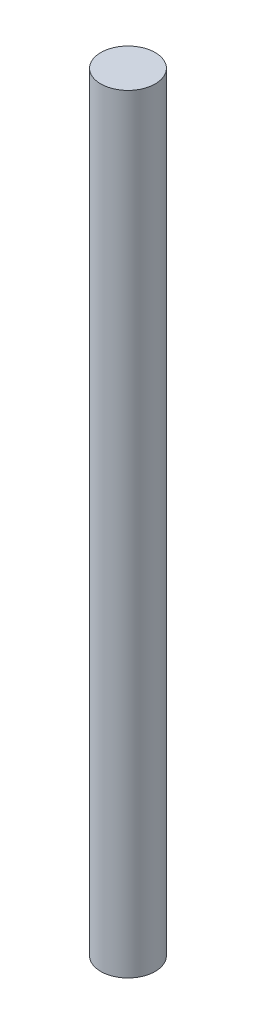
ISO-10303-21;
HEADER;
FILE_DESCRIPTION(('STEP AP214'),'2;1');
FILE_NAME('part.step','',(''),(''),'','','');
FILE_SCHEMA(('AUTOMOTIVE_DESIGN { 1 0 10303 214 1 1 1 1 }'));
ENDSEC;
DATA;
#1=APPLICATION_CONTEXT('core data for automotive mechanical design processes');
#2=APPLICATION_PROTOCOL_DEFINITION('international standard','automotive_design',2000,#1);
#3=PRODUCT_CONTEXT('',#1,'mechanical');
#4=PRODUCT('Part','Part','',(#3));
#5=PRODUCT_RELATED_PRODUCT_CATEGORY('part','',(#4));
#6=PRODUCT_DEFINITION_FORMATION('','',#4);
#7=PRODUCT_DEFINITION_CONTEXT('part definition',#1,'design');
#8=PRODUCT_DEFINITION('design','',#6,#7);
#9=PRODUCT_DEFINITION_SHAPE('','',#8);
#10=(LENGTH_UNIT() NAMED_UNIT(*) SI_UNIT(.MILLI.,.METRE.));
#11=(NAMED_UNIT(*) PLANE_ANGLE_UNIT() SI_UNIT($,.RADIAN.));
#12=(NAMED_UNIT(*) SI_UNIT($,.STERADIAN.) SOLID_ANGLE_UNIT());
#13=UNCERTAINTY_MEASURE_WITH_UNIT(LENGTH_MEASURE(1.E-05),#10,'distance_accuracy_value','');
#14=(GEOMETRIC_REPRESENTATION_CONTEXT(3) GLOBAL_UNCERTAINTY_ASSIGNED_CONTEXT((#13)) GLOBAL_UNIT_ASSIGNED_CONTEXT((#10,
#11,#12)) REPRESENTATION_CONTEXT('',''));
#15=CARTESIAN_POINT('',(0.,0.,0.));
#16=DIRECTION('',(0.,0.,1.));
#17=DIRECTION('',(1.,0.,0.));
#18=AXIS2_PLACEMENT_3D('',#15,#16,#17);
#19=CARTESIAN_POINT('',(0.,113.,0.));
#20=DIRECTION('',(0.,-1.,0.));
#21=DIRECTION('',(0.,0.,-1.));
#22=AXIS2_PLACEMENT_3D('',#19,#20,#21);
#23=CYLINDRICAL_SURFACE('',#22,4.);
#24=CARTESIAN_POINT('',(0.,113.,0.));
#25=DIRECTION('',(0.,1.,0.));
#26=DIRECTION('',(0.,0.,1.));
#27=AXIS2_PLACEMENT_3D('',#24,#25,#26);
#28=CIRCLE('',#27,4.);
#29=CARTESIAN_POINT('',(0.,113.,4.));
#30=VERTEX_POINT('',#29);
#31=EDGE_CURVE('E10',#30,#30,#28,.T.);
#32=ORIENTED_EDGE('',*,*,#31,.F.);
#33=EDGE_LOOP('',(#32));
#34=FACE_BOUND('',#33,.T.);
#35=CARTESIAN_POINT('',(0.,0.,0.));
#36=DIRECTION('',(0.,1.,0.));
#37=DIRECTION('',(0.,0.,1.));
#38=AXIS2_PLACEMENT_3D('',#35,#36,#37);
#39=CIRCLE('',#38,4.);
#40=CARTESIAN_POINT('',(0.,0.,4.));
#41=VERTEX_POINT('',#40);
#42=EDGE_CURVE('E42',#41,#41,#39,.T.);
#43=ORIENTED_EDGE('',*,*,#42,.T.);
#44=EDGE_LOOP('',(#43));
#45=FACE_BOUND('',#44,.T.);
#46=ADVANCED_FACE('F39',(#34,#45),#23,.T.);
#47=CARTESIAN_POINT('',(0.,113.,0.));
#48=DIRECTION('',(0.,1.,0.));
#49=DIRECTION('',(0.,0.,1.));
#50=AXIS2_PLACEMENT_3D('',#47,#48,#49);
#51=PLANE('',#50);
#52=ORIENTED_EDGE('',*,*,#31,.T.);
#53=EDGE_LOOP('',(#52));
#54=FACE_BOUND('',#53,.T.);
#55=ADVANCED_FACE('F54',(#54),#51,.T.);
#56=CARTESIAN_POINT('',(0.,0.,0.));
#57=DIRECTION('',(0.,1.,0.));
#58=DIRECTION('',(0.,0.,1.));
#59=AXIS2_PLACEMENT_3D('',#56,#57,#58);
#60=PLANE('',#59);
#61=ORIENTED_EDGE('',*,*,#42,.F.);
#62=EDGE_LOOP('',(#61));
#63=FACE_BOUND('',#62,.T.);
#64=ADVANCED_FACE('F52',(#63),#60,.F.);
#65=CLOSED_SHELL('',(#46,#55,#64));
#66=MANIFOLD_SOLID_BREP('B2',#65);
#67=ADVANCED_BREP_SHAPE_REPRESENTATION('',(#18,#66),#14);
#68=SHAPE_DEFINITION_REPRESENTATION(#9,#67);
ENDSEC;
END-ISO-10303-21;
